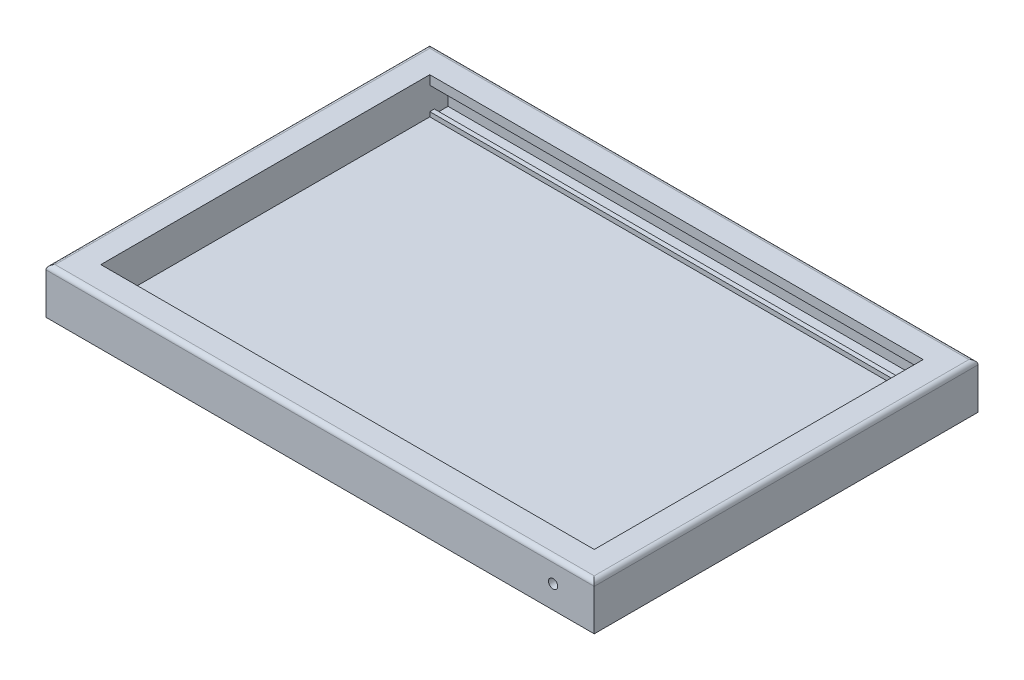
ISO-10303-21;
HEADER;
FILE_DESCRIPTION(('STEP AP214'),'2;1');
FILE_NAME('part.step','',(''),(''),'','','');
FILE_SCHEMA(('AUTOMOTIVE_DESIGN { 1 0 10303 214 1 1 1 1 }'));
ENDSEC;
DATA;
#1=APPLICATION_CONTEXT('core data for automotive mechanical design processes');
#2=APPLICATION_PROTOCOL_DEFINITION('international standard','automotive_design',2000,#1);
#3=PRODUCT_CONTEXT('',#1,'mechanical');
#4=PRODUCT('Part','Part','',(#3));
#5=PRODUCT_RELATED_PRODUCT_CATEGORY('part','',(#4));
#6=PRODUCT_DEFINITION_FORMATION('','',#4);
#7=PRODUCT_DEFINITION_CONTEXT('part definition',#1,'design');
#8=PRODUCT_DEFINITION('design','',#6,#7);
#9=PRODUCT_DEFINITION_SHAPE('','',#8);
#10=(LENGTH_UNIT() NAMED_UNIT(*) SI_UNIT(.MILLI.,.METRE.));
#11=(NAMED_UNIT(*) PLANE_ANGLE_UNIT() SI_UNIT($,.RADIAN.));
#12=(NAMED_UNIT(*) SI_UNIT($,.STERADIAN.) SOLID_ANGLE_UNIT());
#13=UNCERTAINTY_MEASURE_WITH_UNIT(LENGTH_MEASURE(1.E-05),#10,'distance_accuracy_value','');
#14=(GEOMETRIC_REPRESENTATION_CONTEXT(3) GLOBAL_UNCERTAINTY_ASSIGNED_CONTEXT((#13)) GLOBAL_UNIT_ASSIGNED_CONTEXT((#10,
#11,#12)) REPRESENTATION_CONTEXT('',''));
#15=CARTESIAN_POINT('',(0.,0.,0.));
#16=DIRECTION('',(0.,0.,1.));
#17=DIRECTION('',(1.,0.,0.));
#18=AXIS2_PLACEMENT_3D('',#15,#16,#17);
#19=CARTESIAN_POINT('',(-541.27868852459,10.,12.));
#20=DIRECTION('',(0.,0.,-1.));
#21=DIRECTION('',(-1.,0.,0.));
#22=AXIS2_PLACEMENT_3D('',#19,#20,#21);
#23=PLANE('',#22);
#24=DIRECTION('',(0.,1.,0.));
#25=VECTOR('',#24,1.);
#26=CARTESIAN_POINT('',(-541.27868852459,10.,12.));
#27=LINE('',#26,#25);
#28=CARTESIAN_POINT('',(-541.27868852459,40.,12.));
#29=VERTEX_POINT('',#28);
#30=CARTESIAN_POINT('',(-541.27868852459,50.,12.));
#31=VERTEX_POINT('',#30);
#32=EDGE_CURVE('E354',#29,#31,#27,.T.);
#33=ORIENTED_EDGE('',*,*,#32,.F.);
#34=DIRECTION('',(1.,0.,0.));
#35=VECTOR('',#34,1.);
#36=CARTESIAN_POINT('',(-541.27868852459,40.,12.));
#37=LINE('',#36,#35);
#38=CARTESIAN_POINT('',(-1.27868852459012,40.,12.));
#39=VERTEX_POINT('',#38);
#40=EDGE_CURVE('E247',#29,#39,#37,.T.);
#41=ORIENTED_EDGE('',*,*,#40,.T.);
#42=DIRECTION('',(0.,1.,0.));
#43=VECTOR('',#42,1.);
#44=CARTESIAN_POINT('',(-1.27868852459012,10.,12.));
#45=LINE('',#44,#43);
#46=CARTESIAN_POINT('',(-1.27868852459012,50.,12.));
#47=VERTEX_POINT('',#46);
#48=EDGE_CURVE('E358',#39,#47,#45,.T.);
#49=ORIENTED_EDGE('',*,*,#48,.T.);
#50=DIRECTION('',(-1.,0.,0.));
#51=VECTOR('',#50,1.);
#52=CARTESIAN_POINT('',(-541.27868852459,50.,12.));
#53=LINE('',#52,#51);
#54=EDGE_CURVE('E347',#47,#31,#53,.T.);
#55=ORIENTED_EDGE('',*,*,#54,.T.);
#56=EDGE_LOOP('',(#33,#41,#49,#55));
#57=FACE_BOUND('',#56,.T.);
#58=ADVANCED_FACE('F33',(#57),#23,.F.);
#59=CARTESIAN_POINT('',(0.,0.,392.));
#60=DIRECTION('',(0.,0.,1.));
#61=DIRECTION('',(1.,0.,0.));
#62=AXIS2_PLACEMENT_3D('',#59,#60,#61);
#63=PLANE('',#62);
#64=CARTESIAN_POINT('',(-16.2786885245901,25.,392.));
#65=DIRECTION('',(0.,0.,1.));
#66=DIRECTION('',(1.,0.,0.));
#67=AXIS2_PLACEMENT_3D('',#64,#65,#66);
#68=CIRCLE('',#67,5.);
#69=CARTESIAN_POINT('',(-11.2786885245901,25.,392.));
#70=VERTEX_POINT('',#69);
#71=EDGE_CURVE('E227',#70,#70,#68,.T.);
#72=ORIENTED_EDGE('',*,*,#71,.T.);
#73=EDGE_LOOP('',(#72));
#74=FACE_BOUND('',#73,.T.);
#75=DIRECTION('',(0.,1.,0.));
#76=VECTOR('',#75,1.);
#77=CARTESIAN_POINT('',(-541.27868852459,10.,392.));
#78=LINE('',#77,#76);
#79=CARTESIAN_POINT('',(-541.27868852459,10.,392.));
#80=VERTEX_POINT('',#79);
#81=CARTESIAN_POINT('',(-541.27868852459,45.,392.));
#82=VERTEX_POINT('',#81);
#83=EDGE_CURVE('E323',#80,#82,#78,.T.);
#84=ORIENTED_EDGE('',*,*,#83,.T.);
#85=DIRECTION('',(1.,0.,0.));
#86=VECTOR('',#85,1.);
#87=CARTESIAN_POINT('',(-1.27868852459012,45.,392.));
#88=LINE('',#87,#86);
#89=CARTESIAN_POINT('',(-1.27868852459012,45.,392.));
#90=VERTEX_POINT('',#89);
#91=EDGE_CURVE('E281',#82,#90,#88,.T.);
#92=ORIENTED_EDGE('',*,*,#91,.T.);
#93=DIRECTION('',(0.,-1.,0.));
#94=VECTOR('',#93,1.);
#95=CARTESIAN_POINT('',(-1.27868852459012,10.,392.));
#96=LINE('',#95,#94);
#97=CARTESIAN_POINT('',(-1.27868852459012,10.,392.));
#98=VERTEX_POINT('',#97);
#99=EDGE_CURVE('E316',#90,#98,#96,.T.);
#100=ORIENTED_EDGE('',*,*,#99,.T.);
#101=DIRECTION('',(-1.,0.,0.));
#102=VECTOR('',#101,1.);
#103=CARTESIAN_POINT('',(-1.27868852459012,10.,392.));
#104=LINE('',#103,#102);
#105=EDGE_CURVE('E320',#98,#80,#104,.T.);
#106=ORIENTED_EDGE('',*,*,#105,.T.);
#107=EDGE_LOOP('',(#84,#92,#100,#106));
#108=FACE_BOUND('',#107,.T.);
#109=ADVANCED_FACE('F437',(#74,#108),#63,.F.);
#110=CARTESIAN_POINT('',(0.,10.,0.));
#111=DIRECTION('',(0.,1.,0.));
#112=DIRECTION('',(0.,0.,1.));
#113=AXIS2_PLACEMENT_3D('',#110,#111,#112);
#114=PLANE('',#113);
#115=DIRECTION('',(1.,0.,0.));
#116=VECTOR('',#115,1.);
#117=CARTESIAN_POINT('',(-1.27868852459012,10.,377.));
#118=LINE('',#117,#116);
#119=CARTESIAN_POINT('',(-541.27868852459,10.,377.));
#120=VERTEX_POINT('',#119);
#121=CARTESIAN_POINT('',(-1.27868852459012,10.,377.));
#122=VERTEX_POINT('',#121);
#123=EDGE_CURVE('E299',#120,#122,#118,.T.);
#124=ORIENTED_EDGE('',*,*,#123,.F.);
#125=DIRECTION('',(0.,0.,1.));
#126=VECTOR('',#125,1.);
#127=CARTESIAN_POINT('',(-541.27868852459,10.,12.));
#128=LINE('',#127,#126);
#129=EDGE_CURVE('E337',#120,#80,#128,.T.);
#130=ORIENTED_EDGE('',*,*,#129,.T.);
#131=ORIENTED_EDGE('',*,*,#105,.F.);
#132=DIRECTION('',(0.,0.,-1.));
#133=VECTOR('',#132,1.);
#134=CARTESIAN_POINT('',(-1.27868852459012,10.,12.));
#135=LINE('',#134,#133);
#136=EDGE_CURVE('E217',#98,#122,#135,.T.);
#137=ORIENTED_EDGE('',*,*,#136,.T.);
#138=EDGE_LOOP('',(#124,#130,#131,#137));
#139=FACE_BOUND('',#138,.T.);
#140=ADVANCED_FACE('F500',(#139),#114,.T.);
#141=CARTESIAN_POINT('',(-1.27868852459012,10.,377.));
#142=DIRECTION('',(0.,0.,1.));
#143=DIRECTION('',(1.,0.,0.));
#144=AXIS2_PLACEMENT_3D('',#141,#142,#143);
#145=PLANE('',#144);
#146=DIRECTION('',(1.,0.,0.));
#147=VECTOR('',#146,1.);
#148=CARTESIAN_POINT('',(-1.27868852459012,15.,377.));
#149=LINE('',#148,#147);
#150=CARTESIAN_POINT('',(-541.27868852459,15.,377.));
#151=VERTEX_POINT('',#150);
#152=CARTESIAN_POINT('',(-1.27868852459013,15.,377.));
#153=VERTEX_POINT('',#152);
#154=EDGE_CURVE('E382',#151,#153,#149,.T.);
#155=ORIENTED_EDGE('',*,*,#154,.F.);
#156=DIRECTION('',(0.,1.,0.));
#157=VECTOR('',#156,1.);
#158=CARTESIAN_POINT('',(-541.27868852459,10.,377.));
#159=LINE('',#158,#157);
#160=EDGE_CURVE('E301',#120,#151,#159,.T.);
#161=ORIENTED_EDGE('',*,*,#160,.F.);
#162=ORIENTED_EDGE('',*,*,#123,.T.);
#163=DIRECTION('',(0.,1.,0.));
#164=VECTOR('',#163,1.);
#165=CARTESIAN_POINT('',(-1.27868852459012,10.,377.));
#166=LINE('',#165,#164);
#167=EDGE_CURVE('E302',#122,#153,#166,.T.);
#168=ORIENTED_EDGE('',*,*,#167,.T.);
#169=EDGE_LOOP('',(#155,#161,#162,#168));
#170=FACE_BOUND('',#169,.T.);
#171=ADVANCED_FACE('F525',(#170),#145,.T.);
#172=CARTESIAN_POINT('',(-1.27868852459012,45.,392.));
#173=DIRECTION('',(0.,1.,0.));
#174=DIRECTION('',(0.,0.,1.));
#175=AXIS2_PLACEMENT_3D('',#172,#173,#174);
#176=PLANE('',#175);
#177=DIRECTION('',(0.,0.,-1.));
#178=VECTOR('',#177,1.);
#179=CARTESIAN_POINT('',(-541.27868852459,45.,392.));
#180=LINE('',#179,#178);
#181=CARTESIAN_POINT('',(-541.27868852459,45.,377.));
#182=VERTEX_POINT('',#181);
#183=EDGE_CURVE('E291',#82,#182,#180,.T.);
#184=ORIENTED_EDGE('',*,*,#183,.T.);
#185=DIRECTION('',(1.,0.,0.));
#186=VECTOR('',#185,1.);
#187=CARTESIAN_POINT('',(-1.27868852459012,45.,377.));
#188=LINE('',#187,#186);
#189=CARTESIAN_POINT('',(-1.27868852459012,45.,377.));
#190=VERTEX_POINT('',#189);
#191=EDGE_CURVE('E241',#182,#190,#188,.T.);
#192=ORIENTED_EDGE('',*,*,#191,.T.);
#193=DIRECTION('',(0.,0.,-1.));
#194=VECTOR('',#193,1.);
#195=CARTESIAN_POINT('',(-1.27868852459012,45.,392.));
#196=LINE('',#195,#194);
#197=EDGE_CURVE('E287',#90,#190,#196,.T.);
#198=ORIENTED_EDGE('',*,*,#197,.F.);
#199=ORIENTED_EDGE('',*,*,#91,.F.);
#200=EDGE_LOOP('',(#184,#192,#198,#199));
#201=FACE_BOUND('',#200,.T.);
#202=ADVANCED_FACE('F434',(#201),#176,.F.);
#203=CARTESIAN_POINT('',(-1.27868852459013,15.,392.));
#204=DIRECTION('',(0.,-1.,0.));
#205=DIRECTION('',(0.,0.,-1.));
#206=AXIS2_PLACEMENT_3D('',#203,#204,#205);
#207=PLANE('',#206);
#208=ORIENTED_EDGE('',*,*,#154,.T.);
#209=DIRECTION('',(0.,0.,-1.));
#210=VECTOR('',#209,1.);
#211=CARTESIAN_POINT('',(-1.27868852459013,15.,392.));
#212=LINE('',#211,#210);
#213=CARTESIAN_POINT('',(-1.27868852459012,15.,372.));
#214=VERTEX_POINT('',#213);
#215=EDGE_CURVE('E284',#153,#214,#212,.T.);
#216=ORIENTED_EDGE('',*,*,#215,.T.);
#217=DIRECTION('',(-1.,0.,0.));
#218=VECTOR('',#217,1.);
#219=CARTESIAN_POINT('',(-1.27868852459013,15.,372.));
#220=LINE('',#219,#218);
#221=CARTESIAN_POINT('',(-541.27868852459,15.,372.));
#222=VERTEX_POINT('',#221);
#223=EDGE_CURVE('E274',#214,#222,#220,.T.);
#224=ORIENTED_EDGE('',*,*,#223,.T.);
#225=DIRECTION('',(0.,0.,-1.));
#226=VECTOR('',#225,1.);
#227=CARTESIAN_POINT('',(-541.27868852459,15.,392.));
#228=LINE('',#227,#226);
#229=EDGE_CURVE('E294',#151,#222,#228,.T.);
#230=ORIENTED_EDGE('',*,*,#229,.F.);
#231=EDGE_LOOP('',(#208,#216,#224,#230));
#232=FACE_BOUND('',#231,.T.);
#233=ADVANCED_FACE('F524',(#232),#207,.F.);
#234=CARTESIAN_POINT('',(-541.27868852459,10.,372.));
#235=DIRECTION('',(0.,0.,1.));
#236=DIRECTION('',(1.,0.,0.));
#237=AXIS2_PLACEMENT_3D('',#234,#235,#236);
#238=PLANE('',#237);
#239=DIRECTION('',(0.,1.,0.));
#240=VECTOR('',#239,1.);
#241=CARTESIAN_POINT('',(-1.27868852459012,10.,372.));
#242=LINE('',#241,#240);
#243=CARTESIAN_POINT('',(-1.27868852459012,40.,372.));
#244=VERTEX_POINT('',#243);
#245=CARTESIAN_POINT('',(-1.27868852459012,50.,372.));
#246=VERTEX_POINT('',#245);
#247=EDGE_CURVE('E230',#244,#246,#242,.T.);
#248=ORIENTED_EDGE('',*,*,#247,.F.);
#249=DIRECTION('',(-1.,0.,0.));
#250=VECTOR('',#249,1.);
#251=CARTESIAN_POINT('',(-541.27868852459,40.,372.));
#252=LINE('',#251,#250);
#253=CARTESIAN_POINT('',(-541.27868852459,40.,372.));
#254=VERTEX_POINT('',#253);
#255=EDGE_CURVE('E224',#244,#254,#252,.T.);
#256=ORIENTED_EDGE('',*,*,#255,.T.);
#257=DIRECTION('',(0.,1.,0.));
#258=VECTOR('',#257,1.);
#259=CARTESIAN_POINT('',(-541.27868852459,10.,372.));
#260=LINE('',#259,#258);
#261=CARTESIAN_POINT('',(-541.27868852459,50.,372.));
#262=VERTEX_POINT('',#261);
#263=EDGE_CURVE('E205',#254,#262,#260,.T.);
#264=ORIENTED_EDGE('',*,*,#263,.T.);
#265=DIRECTION('',(1.,0.,0.));
#266=VECTOR('',#265,1.);
#267=CARTESIAN_POINT('',(-541.27868852459,50.,372.));
#268=LINE('',#267,#266);
#269=EDGE_CURVE('E342',#262,#246,#268,.T.);
#270=ORIENTED_EDGE('',*,*,#269,.T.);
#271=EDGE_LOOP('',(#248,#256,#264,#270));
#272=FACE_BOUND('',#271,.T.);
#273=ADVANCED_FACE('F229',(#272),#238,.F.);
#274=DIRECTION('',(-1.,0.,0.));
#275=VECTOR('',#274,1.);
#276=CARTESIAN_POINT('',(-1.27868852459012,10.,372.));
#277=LINE('',#276,#275);
#278=CARTESIAN_POINT('',(-1.27868852459012,10.,372.));
#279=VERTEX_POINT('',#278);
#280=CARTESIAN_POINT('',(-541.27868852459,10.,372.));
#281=VERTEX_POINT('',#280);
#282=EDGE_CURVE('E290',#279,#281,#277,.T.);
#283=ORIENTED_EDGE('',*,*,#282,.F.);
#284=CARTESIAN_POINT('',(-1.27868852459012,10.,12.));
#285=VERTEX_POINT('',#284);
#286=EDGE_CURVE('E340',#279,#285,#135,.T.);
#287=ORIENTED_EDGE('',*,*,#286,.T.);
#288=DIRECTION('',(1.,0.,0.));
#289=VECTOR('',#288,1.);
#290=CARTESIAN_POINT('',(-1.27868852459012,10.,12.));
#291=LINE('',#290,#289);
#292=CARTESIAN_POINT('',(-541.27868852459,10.,12.));
#293=VERTEX_POINT('',#292);
#294=EDGE_CURVE('E309',#293,#285,#291,.T.);
#295=ORIENTED_EDGE('',*,*,#294,.F.);
#296=EDGE_CURVE('E336',#293,#281,#128,.T.);
#297=ORIENTED_EDGE('',*,*,#296,.T.);
#298=EDGE_LOOP('',(#283,#287,#295,#297));
#299=FACE_BOUND('',#298,.T.);
#300=ADVANCED_FACE('F448',(#299),#114,.T.);
#301=CARTESIAN_POINT('',(-571.27868852459,50.,-18.));
#302=DIRECTION('',(1.,0.,0.));
#303=DIRECTION('',(0.,0.,-1.));
#304=AXIS2_PLACEMENT_3D('',#301,#302,#303);
#305=PLANE('',#304);
#306=DIRECTION('',(0.,-1.,0.));
#307=VECTOR('',#306,1.);
#308=CARTESIAN_POINT('',(-571.27868852459,50.,402.));
#309=LINE('',#308,#307);
#310=CARTESIAN_POINT('',(-571.27868852459,45.,402.));
#311=VERTEX_POINT('',#310);
#312=CARTESIAN_POINT('',(-571.27868852459,0.,402.));
#313=VERTEX_POINT('',#312);
#314=EDGE_CURVE('E380',#311,#313,#309,.T.);
#315=ORIENTED_EDGE('',*,*,#314,.F.);
#316=DIRECTION('',(0.,0.,1.));
#317=VECTOR('',#316,1.);
#318=CARTESIAN_POINT('',(-571.27868852459,45.,-18.));
#319=LINE('',#318,#317);
#320=CARTESIAN_POINT('',(-571.27868852459,45.,-18.));
#321=VERTEX_POINT('',#320);
#322=EDGE_CURVE('E42',#311,#321,#319,.F.);
#323=ORIENTED_EDGE('',*,*,#322,.T.);
#324=DIRECTION('',(0.,-1.,0.));
#325=VECTOR('',#324,1.);
#326=CARTESIAN_POINT('',(-571.27868852459,50.,-18.));
#327=LINE('',#326,#325);
#328=CARTESIAN_POINT('',(-571.27868852459,0.,-18.));
#329=VERTEX_POINT('',#328);
#330=EDGE_CURVE('E374',#321,#329,#327,.T.);
#331=ORIENTED_EDGE('',*,*,#330,.T.);
#332=DIRECTION('',(0.,0.,1.));
#333=VECTOR('',#332,1.);
#334=CARTESIAN_POINT('',(-571.27868852459,0.,-18.));
#335=LINE('',#334,#333);
#336=EDGE_CURVE('E353',#329,#313,#335,.T.);
#337=ORIENTED_EDGE('',*,*,#336,.T.);
#338=EDGE_LOOP('',(#315,#323,#331,#337));
#339=FACE_BOUND('',#338,.T.);
#340=ADVANCED_FACE('F543',(#339),#305,.F.);
#341=CARTESIAN_POINT('',(-571.27868852459,50.,402.));
#342=DIRECTION('',(0.,0.,-1.));
#343=DIRECTION('',(-1.,0.,0.));
#344=AXIS2_PLACEMENT_3D('',#341,#342,#343);
#345=PLANE('',#344);
#346=CARTESIAN_POINT('',(-16.2786885245901,25.,402.));
#347=DIRECTION('',(0.,0.,1.));
#348=DIRECTION('',(1.,0.,0.));
#349=AXIS2_PLACEMENT_3D('',#346,#347,#348);
#350=CIRCLE('',#349,5.);
#351=CARTESIAN_POINT('',(-11.2786885245901,25.,402.));
#352=VERTEX_POINT('',#351);
#353=EDGE_CURVE('E415',#352,#352,#350,.T.);
#354=ORIENTED_EDGE('',*,*,#353,.F.);
#355=EDGE_LOOP('',(#354));
#356=FACE_BOUND('',#355,.T.);
#357=DIRECTION('',(0.,-1.,0.));
#358=VECTOR('',#357,1.);
#359=CARTESIAN_POINT('',(28.7213114754099,50.,402.));
#360=LINE('',#359,#358);
#361=CARTESIAN_POINT('',(28.7213114754099,45.,402.));
#362=VERTEX_POINT('',#361);
#363=CARTESIAN_POINT('',(28.7213114754099,0.,402.));
#364=VERTEX_POINT('',#363);
#365=EDGE_CURVE('E378',#362,#364,#360,.T.);
#366=ORIENTED_EDGE('',*,*,#365,.F.);
#367=DIRECTION('',(1.,0.,0.));
#368=VECTOR('',#367,1.);
#369=CARTESIAN_POINT('',(-571.27868852459,45.,402.));
#370=LINE('',#369,#368);
#371=EDGE_CURVE('E11',#362,#311,#370,.F.);
#372=ORIENTED_EDGE('',*,*,#371,.T.);
#373=ORIENTED_EDGE('',*,*,#314,.T.);
#374=DIRECTION('',(1.,0.,0.));
#375=VECTOR('',#374,1.);
#376=CARTESIAN_POINT('',(-571.27868852459,0.,402.));
#377=LINE('',#376,#375);
#378=EDGE_CURVE('E365',#313,#364,#377,.T.);
#379=ORIENTED_EDGE('',*,*,#378,.T.);
#380=EDGE_LOOP('',(#366,#372,#373,#379));
#381=FACE_BOUND('',#380,.T.);
#382=ADVANCED_FACE('F549',(#356,#381),#345,.F.);
#383=CARTESIAN_POINT('',(28.7213114754098,50.,-18.));
#384=DIRECTION('',(-1.,0.,0.));
#385=DIRECTION('',(0.,0.,1.));
#386=AXIS2_PLACEMENT_3D('',#383,#384,#385);
#387=PLANE('',#386);
#388=DIRECTION('',(0.,-1.,0.));
#389=VECTOR('',#388,1.);
#390=CARTESIAN_POINT('',(28.7213114754098,50.,-18.));
#391=LINE('',#390,#389);
#392=CARTESIAN_POINT('',(28.7213114754098,45.,-18.));
#393=VERTEX_POINT('',#392);
#394=CARTESIAN_POINT('',(28.7213114754098,0.,-18.));
#395=VERTEX_POINT('',#394);
#396=EDGE_CURVE('E376',#393,#395,#391,.T.);
#397=ORIENTED_EDGE('',*,*,#396,.F.);
#398=DIRECTION('',(0.,0.,-1.));
#399=VECTOR('',#398,1.);
#400=CARTESIAN_POINT('',(28.7213114754099,45.,402.));
#401=LINE('',#400,#399);
#402=EDGE_CURVE('E399',#393,#362,#401,.F.);
#403=ORIENTED_EDGE('',*,*,#402,.T.);
#404=ORIENTED_EDGE('',*,*,#365,.T.);
#405=DIRECTION('',(0.,0.,-1.));
#406=VECTOR('',#405,1.);
#407=CARTESIAN_POINT('',(28.7213114754098,0.,-18.));
#408=LINE('',#407,#406);
#409=EDGE_CURVE('E368',#364,#395,#408,.T.);
#410=ORIENTED_EDGE('',*,*,#409,.T.);
#411=EDGE_LOOP('',(#397,#403,#404,#410));
#412=FACE_BOUND('',#411,.T.);
#413=ADVANCED_FACE('F562',(#412),#387,.F.);
#414=CARTESIAN_POINT('',(-571.27868852459,50.,-18.));
#415=DIRECTION('',(0.,0.,1.));
#416=DIRECTION('',(1.,0.,0.));
#417=AXIS2_PLACEMENT_3D('',#414,#415,#416);
#418=PLANE('',#417);
#419=CARTESIAN_POINT('',(-16.2786885245901,25.,-18.));
#420=DIRECTION('',(0.,0.,1.));
#421=DIRECTION('',(1.,0.,0.));
#422=AXIS2_PLACEMENT_3D('',#419,#420,#421);
#423=CIRCLE('',#422,5.);
#424=CARTESIAN_POINT('',(-11.2786885245901,25.,-18.));
#425=VERTEX_POINT('',#424);
#426=EDGE_CURVE('E390',#425,#425,#423,.T.);
#427=ORIENTED_EDGE('',*,*,#426,.T.);
#428=EDGE_LOOP('',(#427));
#429=FACE_BOUND('',#428,.T.);
#430=ORIENTED_EDGE('',*,*,#330,.F.);
#431=DIRECTION('',(-1.,0.,0.));
#432=VECTOR('',#431,1.);
#433=CARTESIAN_POINT('',(28.7213114754098,45.,-18.));
#434=LINE('',#433,#432);
#435=EDGE_CURVE('E402',#321,#393,#434,.F.);
#436=ORIENTED_EDGE('',*,*,#435,.T.);
#437=ORIENTED_EDGE('',*,*,#396,.T.);
#438=DIRECTION('',(-1.,0.,0.));
#439=VECTOR('',#438,1.);
#440=CARTESIAN_POINT('',(-571.27868852459,0.,-18.));
#441=LINE('',#440,#439);
#442=EDGE_CURVE('E371',#395,#329,#441,.T.);
#443=ORIENTED_EDGE('',*,*,#442,.T.);
#444=EDGE_LOOP('',(#430,#436,#437,#443));
#445=FACE_BOUND('',#444,.T.);
#446=ADVANCED_FACE('F557',(#429,#445),#418,.F.);
#447=CARTESIAN_POINT('',(0.,50.,0.));
#448=DIRECTION('',(0.,1.,0.));
#449=DIRECTION('',(0.,0.,1.));
#450=AXIS2_PLACEMENT_3D('',#447,#448,#449);
#451=PLANE('',#450);
#452=DIRECTION('',(1.,0.,0.));
#453=VECTOR('',#452,1.);
#454=CARTESIAN_POINT('',(28.7213114754099,50.,397.));
#455=LINE('',#454,#453);
#456=CARTESIAN_POINT('',(-566.27868852459,50.,397.));
#457=VERTEX_POINT('',#456);
#458=CARTESIAN_POINT('',(23.7213114754099,50.,397.));
#459=VERTEX_POINT('',#458);
#460=EDGE_CURVE('E386',#457,#459,#455,.T.);
#461=ORIENTED_EDGE('',*,*,#460,.T.);
#462=DIRECTION('',(0.,0.,-1.));
#463=VECTOR('',#462,1.);
#464=CARTESIAN_POINT('',(23.7213114754098,50.,-18.));
#465=LINE('',#464,#463);
#466=CARTESIAN_POINT('',(23.7213114754098,50.,-13.));
#467=VERTEX_POINT('',#466);
#468=EDGE_CURVE('E396',#459,#467,#465,.T.);
#469=ORIENTED_EDGE('',*,*,#468,.T.);
#470=DIRECTION('',(-1.,0.,0.));
#471=VECTOR('',#470,1.);
#472=CARTESIAN_POINT('',(-571.27868852459,50.,-13.));
#473=LINE('',#472,#471);
#474=CARTESIAN_POINT('',(-566.27868852459,50.,-13.));
#475=VERTEX_POINT('',#474);
#476=EDGE_CURVE('E394',#467,#475,#473,.T.);
#477=ORIENTED_EDGE('',*,*,#476,.T.);
#478=DIRECTION('',(0.,0.,1.));
#479=VECTOR('',#478,1.);
#480=CARTESIAN_POINT('',(-566.27868852459,50.,402.));
#481=LINE('',#480,#479);
#482=EDGE_CURVE('E392',#475,#457,#481,.T.);
#483=ORIENTED_EDGE('',*,*,#482,.T.);
#484=EDGE_LOOP('',(#461,#469,#477,#483));
#485=FACE_BOUND('',#484,.T.);
#486=DIRECTION('',(0.,0.,-1.));
#487=VECTOR('',#486,1.);
#488=CARTESIAN_POINT('',(-1.27868852459012,50.,12.));
#489=LINE('',#488,#487);
#490=EDGE_CURVE('E344',#246,#47,#489,.T.);
#491=ORIENTED_EDGE('',*,*,#490,.F.);
#492=ORIENTED_EDGE('',*,*,#269,.F.);
#493=DIRECTION('',(0.,0.,1.));
#494=VECTOR('',#493,1.);
#495=CARTESIAN_POINT('',(-541.27868852459,50.,12.));
#496=LINE('',#495,#494);
#497=EDGE_CURVE('E211',#31,#262,#496,.T.);
#498=ORIENTED_EDGE('',*,*,#497,.F.);
#499=ORIENTED_EDGE('',*,*,#54,.F.);
#500=EDGE_LOOP('',(#491,#492,#498,#499));
#501=FACE_BOUND('',#500,.T.);
#502=ADVANCED_FACE('F489',(#485,#501),#451,.T.);
#503=CARTESIAN_POINT('',(0.,0.,0.));
#504=DIRECTION('',(0.,1.,0.));
#505=DIRECTION('',(0.,0.,1.));
#506=AXIS2_PLACEMENT_3D('',#503,#504,#505);
#507=PLANE('',#506);
#508=ORIENTED_EDGE('',*,*,#336,.F.);
#509=ORIENTED_EDGE('',*,*,#442,.F.);
#510=ORIENTED_EDGE('',*,*,#409,.F.);
#511=ORIENTED_EDGE('',*,*,#378,.F.);
#512=EDGE_LOOP('',(#508,#509,#510,#511));
#513=FACE_BOUND('',#512,.T.);
#514=ADVANCED_FACE('F481',(#513),#507,.F.);
#515=CARTESIAN_POINT('',(-1.27868852459012,15.,12.));
#516=VERTEX_POINT('',#515);
#517=EDGE_CURVE('E355',#285,#516,#45,.T.);
#518=ORIENTED_EDGE('',*,*,#517,.T.);
#519=DIRECTION('',(1.,0.,0.));
#520=VECTOR('',#519,1.);
#521=CARTESIAN_POINT('',(-541.27868852459,15.,12.));
#522=LINE('',#521,#520);
#523=CARTESIAN_POINT('',(-541.27868852459,15.,12.));
#524=VERTEX_POINT('',#523);
#525=EDGE_CURVE('E264',#524,#516,#522,.T.);
#526=ORIENTED_EDGE('',*,*,#525,.F.);
#527=EDGE_CURVE('E350',#293,#524,#27,.T.);
#528=ORIENTED_EDGE('',*,*,#527,.F.);
#529=ORIENTED_EDGE('',*,*,#294,.T.);
#530=EDGE_LOOP('',(#518,#526,#528,#529));
#531=FACE_BOUND('',#530,.T.);
#532=ADVANCED_FACE('F479',(#531),#23,.F.);
#533=EDGE_CURVE('E216',#281,#222,#260,.T.);
#534=ORIENTED_EDGE('',*,*,#533,.T.);
#535=ORIENTED_EDGE('',*,*,#223,.F.);
#536=EDGE_CURVE('E359',#279,#214,#242,.T.);
#537=ORIENTED_EDGE('',*,*,#536,.F.);
#538=ORIENTED_EDGE('',*,*,#282,.T.);
#539=EDGE_LOOP('',(#534,#535,#537,#538));
#540=FACE_BOUND('',#539,.T.);
#541=ADVANCED_FACE('F451',(#540),#238,.F.);
#542=CARTESIAN_POINT('',(-541.27868852459,45.,-8.00000000000001));
#543=DIRECTION('',(0.,1.,0.));
#544=DIRECTION('',(0.,0.,1.));
#545=AXIS2_PLACEMENT_3D('',#542,#543,#544);
#546=PLANE('',#545);
#547=DIRECTION('',(0.,0.,1.));
#548=VECTOR('',#547,1.);
#549=CARTESIAN_POINT('',(-1.27868852459012,45.,-8.00000000000001));
#550=LINE('',#549,#548);
#551=CARTESIAN_POINT('',(-1.27868852459012,45.,-8.00000000000001));
#552=VERTEX_POINT('',#551);
#553=CARTESIAN_POINT('',(-1.27868852459012,45.,6.99999999999999));
#554=VERTEX_POINT('',#553);
#555=EDGE_CURVE('E275',#552,#554,#550,.T.);
#556=ORIENTED_EDGE('',*,*,#555,.T.);
#557=DIRECTION('',(-1.,0.,0.));
#558=VECTOR('',#557,1.);
#559=CARTESIAN_POINT('',(-541.27868852459,45.,6.99999999999999));
#560=LINE('',#559,#558);
#561=CARTESIAN_POINT('',(-541.27868852459,45.,6.99999999999999));
#562=VERTEX_POINT('',#561);
#563=EDGE_CURVE('E259',#554,#562,#560,.T.);
#564=ORIENTED_EDGE('',*,*,#563,.T.);
#565=DIRECTION('',(0.,0.,1.));
#566=VECTOR('',#565,1.);
#567=CARTESIAN_POINT('',(-541.27868852459,45.,-8.00000000000001));
#568=LINE('',#567,#566);
#569=CARTESIAN_POINT('',(-541.27868852459,45.,-8.00000000000001));
#570=VERTEX_POINT('',#569);
#571=EDGE_CURVE('E271',#570,#562,#568,.T.);
#572=ORIENTED_EDGE('',*,*,#571,.F.);
#573=DIRECTION('',(-1.,0.,0.));
#574=VECTOR('',#573,1.);
#575=CARTESIAN_POINT('',(-541.27868852459,45.,-8.00000000000001));
#576=LINE('',#575,#574);
#577=EDGE_CURVE('E265',#552,#570,#576,.T.);
#578=ORIENTED_EDGE('',*,*,#577,.F.);
#579=EDGE_LOOP('',(#556,#564,#572,#578));
#580=FACE_BOUND('',#579,.T.);
#581=ADVANCED_FACE('F487',(#580),#546,.F.);
#582=CARTESIAN_POINT('',(-541.27868852459,15.,-8.00000000000001));
#583=DIRECTION('',(0.,-1.,0.));
#584=DIRECTION('',(0.,0.,-1.));
#585=AXIS2_PLACEMENT_3D('',#582,#583,#584);
#586=PLANE('',#585);
#587=DIRECTION('',(-1.,0.,0.));
#588=VECTOR('',#587,1.);
#589=CARTESIAN_POINT('',(-1.27868852459012,15.,6.99999999999999));
#590=LINE('',#589,#588);
#591=CARTESIAN_POINT('',(-1.27868852459012,15.,6.99999999999999));
#592=VERTEX_POINT('',#591);
#593=CARTESIAN_POINT('',(-541.27868852459,15.,7.00000000000003));
#594=VERTEX_POINT('',#593);
#595=EDGE_CURVE('E384',#592,#594,#590,.T.);
#596=ORIENTED_EDGE('',*,*,#595,.T.);
#597=DIRECTION('',(0.,0.,1.));
#598=VECTOR('',#597,1.);
#599=CARTESIAN_POINT('',(-541.27868852459,15.,-8.00000000000001));
#600=LINE('',#599,#598);
#601=EDGE_CURVE('E268',#594,#524,#600,.T.);
#602=ORIENTED_EDGE('',*,*,#601,.T.);
#603=ORIENTED_EDGE('',*,*,#525,.T.);
#604=DIRECTION('',(0.,0.,1.));
#605=VECTOR('',#604,1.);
#606=CARTESIAN_POINT('',(-1.27868852459012,15.,-8.00000000000001));
#607=LINE('',#606,#605);
#608=EDGE_CURVE('E278',#592,#516,#607,.T.);
#609=ORIENTED_EDGE('',*,*,#608,.F.);
#610=EDGE_LOOP('',(#596,#602,#603,#609));
#611=FACE_BOUND('',#610,.T.);
#612=ADVANCED_FACE('F477',(#611),#586,.F.);
#613=CARTESIAN_POINT('',(0.,0.,-8.00000000000001));
#614=DIRECTION('',(0.,0.,-1.));
#615=DIRECTION('',(-1.,0.,0.));
#616=AXIS2_PLACEMENT_3D('',#613,#614,#615);
#617=PLANE('',#616);
#618=CARTESIAN_POINT('',(-16.2786885245901,25.,-8.00000000000001));
#619=DIRECTION('',(0.,0.,-1.));
#620=DIRECTION('',(-1.,0.,0.));
#621=AXIS2_PLACEMENT_3D('',#618,#619,#620);
#622=CIRCLE('',#621,5.);
#623=CARTESIAN_POINT('',(-21.2786885245901,25.,-8.00000000000001));
#624=VERTEX_POINT('',#623);
#625=EDGE_CURVE('E387',#624,#624,#622,.T.);
#626=ORIENTED_EDGE('',*,*,#625,.T.);
#627=EDGE_LOOP('',(#626));
#628=FACE_BOUND('',#627,.T.);
#629=DIRECTION('',(0.,1.,0.));
#630=VECTOR('',#629,1.);
#631=CARTESIAN_POINT('',(-1.27868852459012,10.,-8.00000000000001));
#632=LINE('',#631,#630);
#633=CARTESIAN_POINT('',(-1.27868852459012,10.,-8.00000000000001));
#634=VERTEX_POINT('',#633);
#635=EDGE_CURVE('E330',#634,#552,#632,.T.);
#636=ORIENTED_EDGE('',*,*,#635,.T.);
#637=ORIENTED_EDGE('',*,*,#577,.T.);
#638=DIRECTION('',(0.,-1.,0.));
#639=VECTOR('',#638,1.);
#640=CARTESIAN_POINT('',(-541.27868852459,10.,-8.00000000000001));
#641=LINE('',#640,#639);
#642=CARTESIAN_POINT('',(-541.27868852459,10.,-8.00000000000001));
#643=VERTEX_POINT('',#642);
#644=EDGE_CURVE('E325',#570,#643,#641,.T.);
#645=ORIENTED_EDGE('',*,*,#644,.T.);
#646=DIRECTION('',(1.,0.,0.));
#647=VECTOR('',#646,1.);
#648=CARTESIAN_POINT('',(-541.27868852459,10.,-8.00000000000001));
#649=LINE('',#648,#647);
#650=EDGE_CURVE('E327',#643,#634,#649,.T.);
#651=ORIENTED_EDGE('',*,*,#650,.T.);
#652=EDGE_LOOP('',(#636,#637,#645,#651));
#653=FACE_BOUND('',#652,.T.);
#654=ADVANCED_FACE('F467',(#628,#653),#617,.F.);
#655=DIRECTION('',(-1.,0.,0.));
#656=VECTOR('',#655,1.);
#657=CARTESIAN_POINT('',(-1.27868852459012,10.,6.99999999999999));
#658=LINE('',#657,#656);
#659=CARTESIAN_POINT('',(-1.27868852459012,10.,6.99999999999999));
#660=VERTEX_POINT('',#659);
#661=CARTESIAN_POINT('',(-541.27868852459,10.,7.00000000000006));
#662=VERTEX_POINT('',#661);
#663=EDGE_CURVE('E305',#660,#662,#658,.T.);
#664=ORIENTED_EDGE('',*,*,#663,.F.);
#665=EDGE_CURVE('E335',#660,#634,#135,.T.);
#666=ORIENTED_EDGE('',*,*,#665,.T.);
#667=ORIENTED_EDGE('',*,*,#650,.F.);
#668=EDGE_CURVE('E332',#643,#662,#128,.T.);
#669=ORIENTED_EDGE('',*,*,#668,.T.);
#670=EDGE_LOOP('',(#664,#666,#667,#669));
#671=FACE_BOUND('',#670,.T.);
#672=ADVANCED_FACE('F463',(#671),#114,.T.);
#673=CARTESIAN_POINT('',(-1.27868852459012,10.,12.));
#674=DIRECTION('',(1.,0.,0.));
#675=DIRECTION('',(0.,0.,-1.));
#676=AXIS2_PLACEMENT_3D('',#673,#674,#675);
#677=PLANE('',#676);
#678=DIRECTION('',(0.,0.,-1.));
#679=VECTOR('',#678,1.);
#680=CARTESIAN_POINT('',(-1.27868852459012,40.,372.));
#681=LINE('',#680,#679);
#682=CARTESIAN_POINT('',(-1.27868852459012,40.,377.));
#683=VERTEX_POINT('',#682);
#684=EDGE_CURVE('E233',#683,#244,#681,.T.);
#685=ORIENTED_EDGE('',*,*,#684,.T.);
#686=ORIENTED_EDGE('',*,*,#247,.T.);
#687=ORIENTED_EDGE('',*,*,#490,.T.);
#688=ORIENTED_EDGE('',*,*,#48,.F.);
#689=DIRECTION('',(0.,0.,-1.));
#690=VECTOR('',#689,1.);
#691=CARTESIAN_POINT('',(-1.27868852459012,40.,12.));
#692=LINE('',#691,#690);
#693=CARTESIAN_POINT('',(-1.27868852459012,40.,6.99999999999999));
#694=VERTEX_POINT('',#693);
#695=EDGE_CURVE('E250',#39,#694,#692,.T.);
#696=ORIENTED_EDGE('',*,*,#695,.T.);
#697=DIRECTION('',(0.,1.,0.));
#698=VECTOR('',#697,1.);
#699=CARTESIAN_POINT('',(-1.27868852459012,40.,6.99999999999999));
#700=LINE('',#699,#698);
#701=EDGE_CURVE('E256',#694,#554,#700,.T.);
#702=ORIENTED_EDGE('',*,*,#701,.T.);
#703=ORIENTED_EDGE('',*,*,#555,.F.);
#704=ORIENTED_EDGE('',*,*,#635,.F.);
#705=ORIENTED_EDGE('',*,*,#665,.F.);
#706=DIRECTION('',(0.,1.,0.));
#707=VECTOR('',#706,1.);
#708=CARTESIAN_POINT('',(-1.27868852459012,10.,6.99999999999999));
#709=LINE('',#708,#707);
#710=EDGE_CURVE('E312',#660,#592,#709,.T.);
#711=ORIENTED_EDGE('',*,*,#710,.T.);
#712=ORIENTED_EDGE('',*,*,#608,.T.);
#713=ORIENTED_EDGE('',*,*,#517,.F.);
#714=ORIENTED_EDGE('',*,*,#286,.F.);
#715=ORIENTED_EDGE('',*,*,#536,.T.);
#716=ORIENTED_EDGE('',*,*,#215,.F.);
#717=ORIENTED_EDGE('',*,*,#167,.F.);
#718=ORIENTED_EDGE('',*,*,#136,.F.);
#719=ORIENTED_EDGE('',*,*,#99,.F.);
#720=ORIENTED_EDGE('',*,*,#197,.T.);
#721=DIRECTION('',(0.,1.,0.));
#722=VECTOR('',#721,1.);
#723=CARTESIAN_POINT('',(-1.27868852459012,40.,377.));
#724=LINE('',#723,#722);
#725=EDGE_CURVE('E235',#683,#190,#724,.T.);
#726=ORIENTED_EDGE('',*,*,#725,.F.);
#727=EDGE_LOOP('',(#685,#686,#687,#688,#696,#702,#703,#704,#705,#711,#712,#713,#714,#715,#716,
#717,#718,#719,#720,#726));
#728=FACE_BOUND('',#727,.T.);
#729=ADVANCED_FACE('F455',(#728),#677,.F.);
#730=CARTESIAN_POINT('',(-541.27868852459,10.,12.));
#731=DIRECTION('',(-1.,0.,0.));
#732=DIRECTION('',(0.,0.,1.));
#733=AXIS2_PLACEMENT_3D('',#730,#731,#732);
#734=PLANE('',#733);
#735=ORIENTED_EDGE('',*,*,#263,.F.);
#736=DIRECTION('',(0.,0.,1.));
#737=VECTOR('',#736,1.);
#738=CARTESIAN_POINT('',(-541.27868852459,40.,372.));
#739=LINE('',#738,#737);
#740=CARTESIAN_POINT('',(-541.27868852459,40.,377.));
#741=VERTEX_POINT('',#740);
#742=EDGE_CURVE('E208',#254,#741,#739,.T.);
#743=ORIENTED_EDGE('',*,*,#742,.T.);
#744=DIRECTION('',(0.,1.,0.));
#745=VECTOR('',#744,1.);
#746=CARTESIAN_POINT('',(-541.27868852459,40.,377.));
#747=LINE('',#746,#745);
#748=EDGE_CURVE('E232',#741,#182,#747,.T.);
#749=ORIENTED_EDGE('',*,*,#748,.T.);
#750=ORIENTED_EDGE('',*,*,#183,.F.);
#751=ORIENTED_EDGE('',*,*,#83,.F.);
#752=ORIENTED_EDGE('',*,*,#129,.F.);
#753=ORIENTED_EDGE('',*,*,#160,.T.);
#754=ORIENTED_EDGE('',*,*,#229,.T.);
#755=ORIENTED_EDGE('',*,*,#533,.F.);
#756=ORIENTED_EDGE('',*,*,#296,.F.);
#757=ORIENTED_EDGE('',*,*,#527,.T.);
#758=ORIENTED_EDGE('',*,*,#601,.F.);
#759=DIRECTION('',(0.,1.,0.));
#760=VECTOR('',#759,1.);
#761=CARTESIAN_POINT('',(-541.27868852459,10.,7.00000000000006));
#762=LINE('',#761,#760);
#763=EDGE_CURVE('E313',#662,#594,#762,.T.);
#764=ORIENTED_EDGE('',*,*,#763,.F.);
#765=ORIENTED_EDGE('',*,*,#668,.F.);
#766=ORIENTED_EDGE('',*,*,#644,.F.);
#767=ORIENTED_EDGE('',*,*,#571,.T.);
#768=DIRECTION('',(0.,1.,0.));
#769=VECTOR('',#768,1.);
#770=CARTESIAN_POINT('',(-541.27868852459,40.,6.99999999999999));
#771=LINE('',#770,#769);
#772=CARTESIAN_POINT('',(-541.27868852459,40.,6.99999999999999));
#773=VERTEX_POINT('',#772);
#774=EDGE_CURVE('E257',#773,#562,#771,.T.);
#775=ORIENTED_EDGE('',*,*,#774,.F.);
#776=DIRECTION('',(0.,0.,1.));
#777=VECTOR('',#776,1.);
#778=CARTESIAN_POINT('',(-541.27868852459,40.,12.));
#779=LINE('',#778,#777);
#780=EDGE_CURVE('E244',#773,#29,#779,.T.);
#781=ORIENTED_EDGE('',*,*,#780,.T.);
#782=ORIENTED_EDGE('',*,*,#32,.T.);
#783=ORIENTED_EDGE('',*,*,#497,.T.);
#784=EDGE_LOOP('',(#735,#743,#749,#750,#751,#752,#753,#754,#755,#756,#757,#758,#764,#765,#766,
#767,#775,#781,#782,#783));
#785=FACE_BOUND('',#784,.T.);
#786=ADVANCED_FACE('F207',(#785),#734,.F.);
#787=CARTESIAN_POINT('',(-1.27868852459012,10.,6.99999999999999));
#788=DIRECTION('',(0.,0.,-1.));
#789=DIRECTION('',(-1.,0.,0.));
#790=AXIS2_PLACEMENT_3D('',#787,#788,#789);
#791=PLANE('',#790);
#792=ORIENTED_EDGE('',*,*,#595,.F.);
#793=ORIENTED_EDGE('',*,*,#710,.F.);
#794=ORIENTED_EDGE('',*,*,#663,.T.);
#795=ORIENTED_EDGE('',*,*,#763,.T.);
#796=EDGE_LOOP('',(#792,#793,#794,#795));
#797=FACE_BOUND('',#796,.T.);
#798=ADVANCED_FACE('F474',(#797),#791,.T.);
#799=CARTESIAN_POINT('',(-541.27868852459,40.,6.99999999999999));
#800=DIRECTION('',(0.,0.,-1.));
#801=DIRECTION('',(-1.,0.,0.));
#802=AXIS2_PLACEMENT_3D('',#799,#800,#801);
#803=PLANE('',#802);
#804=ORIENTED_EDGE('',*,*,#563,.F.);
#805=ORIENTED_EDGE('',*,*,#701,.F.);
#806=DIRECTION('',(-1.,0.,0.));
#807=VECTOR('',#806,1.);
#808=CARTESIAN_POINT('',(-541.27868852459,40.,6.99999999999999));
#809=LINE('',#808,#807);
#810=EDGE_CURVE('E253',#694,#773,#809,.T.);
#811=ORIENTED_EDGE('',*,*,#810,.T.);
#812=ORIENTED_EDGE('',*,*,#774,.T.);
#813=EDGE_LOOP('',(#804,#805,#811,#812));
#814=FACE_BOUND('',#813,.T.);
#815=ADVANCED_FACE('F511',(#814),#803,.T.);
#816=CARTESIAN_POINT('',(0.,40.,0.));
#817=DIRECTION('',(0.,-1.,0.));
#818=DIRECTION('',(0.,0.,-1.));
#819=AXIS2_PLACEMENT_3D('',#816,#817,#818);
#820=PLANE('',#819);
#821=ORIENTED_EDGE('',*,*,#780,.F.);
#822=ORIENTED_EDGE('',*,*,#810,.F.);
#823=ORIENTED_EDGE('',*,*,#695,.F.);
#824=ORIENTED_EDGE('',*,*,#40,.F.);
#825=EDGE_LOOP('',(#821,#822,#823,#824));
#826=FACE_BOUND('',#825,.T.);
#827=ADVANCED_FACE('F507',(#826),#820,.T.);
#828=CARTESIAN_POINT('',(-541.27868852459,40.,377.));
#829=DIRECTION('',(0.,0.,1.));
#830=DIRECTION('',(1.,0.,0.));
#831=AXIS2_PLACEMENT_3D('',#828,#829,#830);
#832=PLANE('',#831);
#833=ORIENTED_EDGE('',*,*,#191,.F.);
#834=ORIENTED_EDGE('',*,*,#748,.F.);
#835=DIRECTION('',(1.,0.,0.));
#836=VECTOR('',#835,1.);
#837=CARTESIAN_POINT('',(-541.27868852459,40.,377.));
#838=LINE('',#837,#836);
#839=EDGE_CURVE('E226',#741,#683,#838,.T.);
#840=ORIENTED_EDGE('',*,*,#839,.T.);
#841=ORIENTED_EDGE('',*,*,#725,.T.);
#842=EDGE_LOOP('',(#833,#834,#840,#841));
#843=FACE_BOUND('',#842,.T.);
#844=ADVANCED_FACE('F429',(#843),#832,.T.);
#845=CARTESIAN_POINT('',(0.,40.,0.));
#846=DIRECTION('',(0.,1.,0.));
#847=DIRECTION('',(0.,0.,1.));
#848=AXIS2_PLACEMENT_3D('',#845,#846,#847);
#849=PLANE('',#848);
#850=ORIENTED_EDGE('',*,*,#742,.F.);
#851=ORIENTED_EDGE('',*,*,#255,.F.);
#852=ORIENTED_EDGE('',*,*,#684,.F.);
#853=ORIENTED_EDGE('',*,*,#839,.F.);
#854=EDGE_LOOP('',(#850,#851,#852,#853));
#855=FACE_BOUND('',#854,.T.);
#856=ADVANCED_FACE('F222',(#855),#849,.F.);
#857=CARTESIAN_POINT('',(-16.2786885245901,25.,-18.));
#858=DIRECTION('',(0.,0.,1.));
#859=DIRECTION('',(1.,0.,0.));
#860=AXIS2_PLACEMENT_3D('',#857,#858,#859);
#861=CYLINDRICAL_SURFACE('',#860,5.);
#862=ORIENTED_EDGE('',*,*,#426,.F.);
#863=EDGE_LOOP('',(#862));
#864=FACE_BOUND('',#863,.T.);
#865=ORIENTED_EDGE('',*,*,#625,.F.);
#866=EDGE_LOOP('',(#865));
#867=FACE_BOUND('',#866,.T.);
#868=ADVANCED_FACE('F586',(#864,#867),#861,.F.);
#869=ORIENTED_EDGE('',*,*,#353,.T.);
#870=EDGE_LOOP('',(#869));
#871=FACE_BOUND('',#870,.T.);
#872=ORIENTED_EDGE('',*,*,#71,.F.);
#873=EDGE_LOOP('',(#872));
#874=FACE_BOUND('',#873,.T.);
#875=ADVANCED_FACE('F581',(#871,#874),#861,.F.);
#876=CARTESIAN_POINT('',(-566.27868852459,45.,0.));
#877=DIRECTION('',(0.,0.,-1.));
#878=DIRECTION('',(-1.,0.,0.));
#879=AXIS2_PLACEMENT_3D('',#876,#877,#878);
#880=CYLINDRICAL_SURFACE('',#879,5.);
#881=CARTESIAN_POINT('',(-566.27868852459,45.,-13.));
#882=DIRECTION('',(0.707106781186547,0.,-0.707106781186547));
#883=DIRECTION('',(-0.707106781186547,0.,-0.707106781186547));
#884=AXIS2_PLACEMENT_3D('',#881,#882,#883);
#885=ELLIPSE('',#884,7.07106781186547,5.);
#886=EDGE_CURVE('E408',#321,#475,#885,.T.);
#887=ORIENTED_EDGE('',*,*,#886,.F.);
#888=ORIENTED_EDGE('',*,*,#322,.F.);
#889=CARTESIAN_POINT('',(-566.27868852459,45.,397.));
#890=DIRECTION('',(-0.707106781186547,0.,-0.707106781186547));
#891=DIRECTION('',(-0.707106781186547,0.,0.707106781186547));
#892=AXIS2_PLACEMENT_3D('',#889,#890,#891);
#893=ELLIPSE('',#892,7.07106781186547,5.);
#894=EDGE_CURVE('E37',#457,#311,#893,.F.);
#895=ORIENTED_EDGE('',*,*,#894,.F.);
#896=ORIENTED_EDGE('',*,*,#482,.F.);
#897=EDGE_LOOP('',(#887,#888,#895,#896));
#898=FACE_BOUND('',#897,.T.);
#899=ADVANCED_FACE('F35',(#898),#880,.T.);
#900=CARTESIAN_POINT('',(0.,45.,397.));
#901=DIRECTION('',(-1.,0.,0.));
#902=DIRECTION('',(0.,0.,1.));
#903=AXIS2_PLACEMENT_3D('',#900,#901,#902);
#904=CYLINDRICAL_SURFACE('',#903,5.);
#905=ORIENTED_EDGE('',*,*,#894,.T.);
#906=ORIENTED_EDGE('',*,*,#371,.F.);
#907=CARTESIAN_POINT('',(23.7213114754099,45.,397.));
#908=DIRECTION('',(-0.707106781186547,0.,0.707106781186548));
#909=DIRECTION('',(-0.707106781186548,0.,-0.707106781186547));
#910=AXIS2_PLACEMENT_3D('',#907,#908,#909);
#911=ELLIPSE('',#910,7.07106781186548,5.);
#912=EDGE_CURVE('E407',#459,#362,#911,.F.);
#913=ORIENTED_EDGE('',*,*,#912,.F.);
#914=ORIENTED_EDGE('',*,*,#460,.F.);
#915=EDGE_LOOP('',(#905,#906,#913,#914));
#916=FACE_BOUND('',#915,.T.);
#917=ADVANCED_FACE('F576',(#916),#904,.T.);
#918=CARTESIAN_POINT('',(0.,45.,-13.));
#919=DIRECTION('',(1.,0.,0.));
#920=DIRECTION('',(0.,0.,-1.));
#921=AXIS2_PLACEMENT_3D('',#918,#919,#920);
#922=CYLINDRICAL_SURFACE('',#921,5.);
#923=ORIENTED_EDGE('',*,*,#886,.T.);
#924=ORIENTED_EDGE('',*,*,#476,.F.);
#925=CARTESIAN_POINT('',(23.7213114754099,45.,-13.));
#926=DIRECTION('',(0.707106781186548,0.,0.707106781186547));
#927=DIRECTION('',(0.707106781186547,0.,-0.707106781186548));
#928=AXIS2_PLACEMENT_3D('',#925,#926,#927);
#929=ELLIPSE('',#928,7.07106781186547,5.);
#930=EDGE_CURVE('E405',#393,#467,#929,.T.);
#931=ORIENTED_EDGE('',*,*,#930,.F.);
#932=ORIENTED_EDGE('',*,*,#435,.F.);
#933=EDGE_LOOP('',(#923,#924,#931,#932));
#934=FACE_BOUND('',#933,.T.);
#935=ADVANCED_FACE('F573',(#934),#922,.T.);
#936=CARTESIAN_POINT('',(23.7213114754099,45.,0.));
#937=DIRECTION('',(0.,0.,1.));
#938=DIRECTION('',(1.,0.,0.));
#939=AXIS2_PLACEMENT_3D('',#936,#937,#938);
#940=CYLINDRICAL_SURFACE('',#939,5.);
#941=ORIENTED_EDGE('',*,*,#912,.T.);
#942=ORIENTED_EDGE('',*,*,#402,.F.);
#943=ORIENTED_EDGE('',*,*,#930,.T.);
#944=ORIENTED_EDGE('',*,*,#468,.F.);
#945=EDGE_LOOP('',(#941,#942,#943,#944));
#946=FACE_BOUND('',#945,.T.);
#947=ADVANCED_FACE('F570',(#946),#940,.T.);
#948=CLOSED_SHELL('',(#58,#109,#140,#171,#202,#233,#273,#300,#340,#382,#413,#446,#502,#514,#532,
#541,#581,#612,#654,#672,#729,#786,#798,#815,#827,#844,#856,#868,#875,#899,#917,#935,#947));
#949=MANIFOLD_SOLID_BREP('B2',#948);
#950=ADVANCED_BREP_SHAPE_REPRESENTATION('',(#18,#949),#14);
#951=SHAPE_DEFINITION_REPRESENTATION(#9,#950);
ENDSEC;
END-ISO-10303-21;
